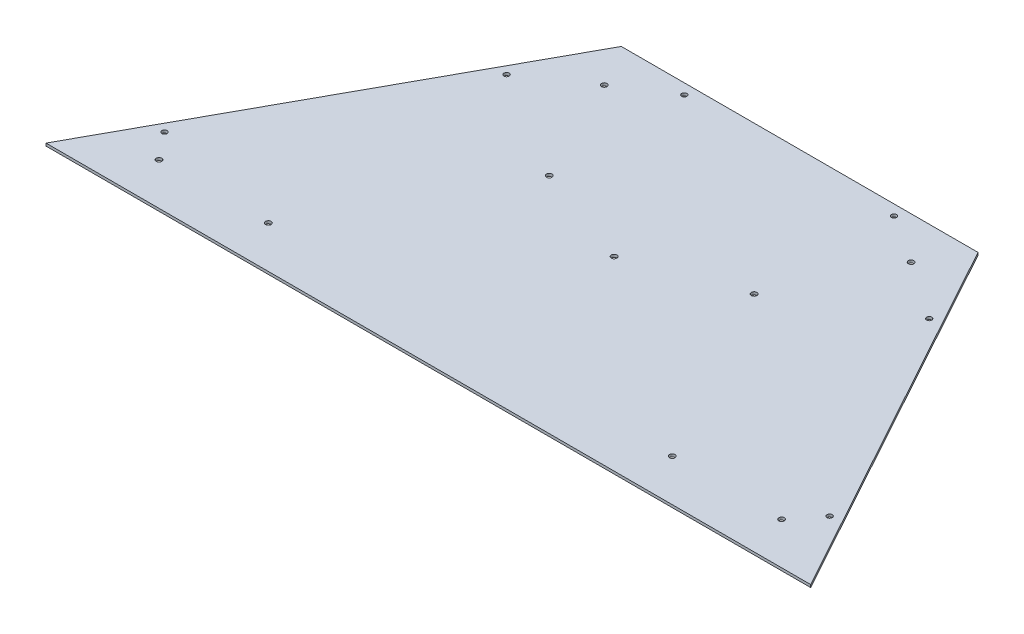
ISO-10303-21;
HEADER;
FILE_DESCRIPTION(('STEP AP214'),'2;1');
FILE_NAME('part.step','',(''),(''),'','','');
FILE_SCHEMA(('AUTOMOTIVE_DESIGN { 1 0 10303 214 1 1 1 1 }'));
ENDSEC;
DATA;
#1=APPLICATION_CONTEXT('core data for automotive mechanical design processes');
#2=APPLICATION_PROTOCOL_DEFINITION('international standard','automotive_design',2000,#1);
#3=PRODUCT_CONTEXT('',#1,'mechanical');
#4=PRODUCT('Part','Part','',(#3));
#5=PRODUCT_RELATED_PRODUCT_CATEGORY('part','',(#4));
#6=PRODUCT_DEFINITION_FORMATION('','',#4);
#7=PRODUCT_DEFINITION_CONTEXT('part definition',#1,'design');
#8=PRODUCT_DEFINITION('design','',#6,#7);
#9=PRODUCT_DEFINITION_SHAPE('','',#8);
#10=(LENGTH_UNIT() NAMED_UNIT(*) SI_UNIT(.MILLI.,.METRE.));
#11=(NAMED_UNIT(*) PLANE_ANGLE_UNIT() SI_UNIT($,.RADIAN.));
#12=(NAMED_UNIT(*) SI_UNIT($,.STERADIAN.) SOLID_ANGLE_UNIT());
#13=UNCERTAINTY_MEASURE_WITH_UNIT(LENGTH_MEASURE(1.E-05),#10,'distance_accuracy_value','');
#14=(GEOMETRIC_REPRESENTATION_CONTEXT(3) GLOBAL_UNCERTAINTY_ASSIGNED_CONTEXT((#13)) GLOBAL_UNIT_ASSIGNED_CONTEXT((#10,
#11,#12)) REPRESENTATION_CONTEXT('',''));
#15=CARTESIAN_POINT('',(0.,0.,0.));
#16=DIRECTION('',(0.,0.,1.));
#17=DIRECTION('',(1.,0.,0.));
#18=AXIS2_PLACEMENT_3D('',#15,#16,#17);
#19=CARTESIAN_POINT('',(0.,0.,0.));
#20=DIRECTION('',(0.,-1.,0.));
#21=DIRECTION('',(0.,0.,-1.));
#22=AXIS2_PLACEMENT_3D('',#19,#20,#21);
#23=PLANE('',#22);
#24=CARTESIAN_POINT('',(-376.682,0.,-50.7999999999999));
#25=DIRECTION('',(0.,1.,0.));
#26=DIRECTION('',(0.,0.,1.));
#27=AXIS2_PLACEMENT_3D('',#24,#25,#26);
#28=CIRCLE('',#27,3.37819999999989);
#29=CARTESIAN_POINT('',(-376.682,0.,-47.4218));
#30=VERTEX_POINT('',#29);
#31=EDGE_CURVE('E197',#30,#30,#28,.T.);
#32=ORIENTED_EDGE('',*,*,#31,.T.);
#33=EDGE_LOOP('',(#32));
#34=FACE_BOUND('',#33,.T.);
#35=CARTESIAN_POINT('',(-244.348,0.,-50.7999999999999));
#36=DIRECTION('',(0.,1.,0.));
#37=DIRECTION('',(0.,0.,1.));
#38=AXIS2_PLACEMENT_3D('',#35,#36,#37);
#39=CIRCLE('',#38,3.37819999999989);
#40=CARTESIAN_POINT('',(-244.348,0.,-47.4218));
#41=VERTEX_POINT('',#40);
#42=EDGE_CURVE('E191',#41,#41,#39,.T.);
#43=ORIENTED_EDGE('',*,*,#42,.T.);
#44=EDGE_LOOP('',(#43));
#45=FACE_BOUND('',#44,.T.);
#46=CARTESIAN_POINT('',(-126.873,0.,-436.565026529998));
#47=DIRECTION('',(0.,1.,0.));
#48=DIRECTION('',(0.,0.,1.));
#49=AXIS2_PLACEMENT_3D('',#46,#47,#48);
#50=CIRCLE('',#49,3.17499999999989);
#51=CARTESIAN_POINT('',(-126.873,0.,-433.390026529998));
#52=VERTEX_POINT('',#51);
#53=EDGE_CURVE('E131',#52,#52,#50,.T.);
#54=ORIENTED_EDGE('',*,*,#53,.T.);
#55=EDGE_LOOP('',(#54));
#56=FACE_BOUND('',#55,.T.);
#57=CARTESIAN_POINT('',(402.368285269326,0.,-83.1601712777649));
#58=DIRECTION('',(0.,1.,0.));
#59=DIRECTION('',(0.,0.,1.));
#60=AXIS2_PLACEMENT_3D('',#57,#58,#59);
#61=CIRCLE('',#60,3.17499999999987);
#62=CARTESIAN_POINT('',(402.368285269326,0.,-79.9851712777651));
#63=VERTEX_POINT('',#62);
#64=EDGE_CURVE('E125',#63,#63,#61,.T.);
#65=ORIENTED_EDGE('',*,*,#64,.T.);
#66=EDGE_LOOP('',(#65));
#67=FACE_BOUND('',#66,.T.);
#68=CARTESIAN_POINT('',(255.632309055253,0.,-350.31479557707));
#69=DIRECTION('',(0.,1.,0.));
#70=DIRECTION('',(0.,0.,1.));
#71=AXIS2_PLACEMENT_3D('',#68,#69,#70);
#72=CIRCLE('',#71,3.17499999999987);
#73=CARTESIAN_POINT('',(255.632309055253,0.,-347.13979557707));
#74=VERTEX_POINT('',#73);
#75=EDGE_CURVE('E119',#74,#74,#72,.T.);
#76=ORIENTED_EDGE('',*,*,#75,.T.);
#77=EDGE_LOOP('',(#76));
#78=FACE_BOUND('',#77,.T.);
#79=CARTESIAN_POINT('',(126.873,0.,-436.565026529998));
#80=DIRECTION('',(0.,1.,0.));
#81=DIRECTION('',(0.,0.,1.));
#82=AXIS2_PLACEMENT_3D('',#79,#80,#81);
#83=CIRCLE('',#82,3.1749999999999);
#84=CARTESIAN_POINT('',(126.873,0.,-433.390026529998));
#85=VERTEX_POINT('',#84);
#86=EDGE_CURVE('E103',#85,#85,#83,.T.);
#87=ORIENTED_EDGE('',*,*,#86,.T.);
#88=EDGE_LOOP('',(#87));
#89=FACE_BOUND('',#88,.T.);
#90=DIRECTION('',(1.,0.,0.));
#91=VECTOR('',#90,1.);
#92=CARTESIAN_POINT('',(462.534,0.,-1.08537011059561E-13));
#93=LINE('',#92,#91);
#94=CARTESIAN_POINT('',(-462.534,0.,0.));
#95=VERTEX_POINT('',#94);
#96=CARTESIAN_POINT('',(462.534,0.,-1.08537011059561E-13));
#97=VERTEX_POINT('',#96);
#98=EDGE_CURVE('E100',#95,#97,#93,.T.);
#99=ORIENTED_EDGE('',*,*,#98,.F.);
#100=DIRECTION('',(-0.481417244796828,0.,0.876491549538403));
#101=VECTOR('',#100,1.);
#102=CARTESIAN_POINT('',(-462.534,0.,0.));
#103=LINE('',#102,#101);
#104=CARTESIAN_POINT('',(-215.773,0.,-449.265026529998));
#105=VERTEX_POINT('',#104);
#106=EDGE_CURVE('E75',#105,#95,#103,.T.);
#107=ORIENTED_EDGE('',*,*,#106,.F.);
#108=DIRECTION('',(-1.,0.,0.));
#109=VECTOR('',#108,1.);
#110=CARTESIAN_POINT('',(-215.773,0.,-449.265026529998));
#111=LINE('',#110,#109);
#112=CARTESIAN_POINT('',(215.773,0.,-449.265026529998));
#113=VERTEX_POINT('',#112);
#114=EDGE_CURVE('E69',#113,#105,#111,.T.);
#115=ORIENTED_EDGE('',*,*,#114,.F.);
#116=DIRECTION('',(-0.481417244796829,0.,-0.876491549538403));
#117=VECTOR('',#116,1.);
#118=CARTESIAN_POINT('',(215.773,0.,-449.265026529998));
#119=LINE('',#118,#117);
#120=EDGE_CURVE('E92',#97,#113,#119,.T.);
#121=ORIENTED_EDGE('',*,*,#120,.F.);
#122=EDGE_LOOP('',(#99,#107,#115,#121));
#123=FACE_BOUND('',#122,.T.);
#124=CARTESIAN_POINT('',(-255.632309055253,0.,-350.31479557707));
#125=DIRECTION('',(0.,1.,0.));
#126=DIRECTION('',(0.,0.,1.));
#127=AXIS2_PLACEMENT_3D('',#124,#125,#126);
#128=CIRCLE('',#127,3.17499999999987);
#129=CARTESIAN_POINT('',(-255.632309055253,0.,-347.13979557707));
#130=VERTEX_POINT('',#129);
#131=EDGE_CURVE('E137',#130,#130,#128,.T.);
#132=ORIENTED_EDGE('',*,*,#131,.T.);
#133=EDGE_LOOP('',(#132));
#134=FACE_BOUND('',#133,.T.);
#135=CARTESIAN_POINT('',(-402.368285269326,0.,-83.1601712777647));
#136=DIRECTION('',(0.,1.,0.));
#137=DIRECTION('',(0.,0.,1.));
#138=AXIS2_PLACEMENT_3D('',#135,#136,#137);
#139=CIRCLE('',#138,3.17499999999987);
#140=CARTESIAN_POINT('',(-402.368285269326,0.,-79.9851712777648));
#141=VERTEX_POINT('',#140);
#142=EDGE_CURVE('E143',#141,#141,#139,.T.);
#143=ORIENTED_EDGE('',*,*,#142,.T.);
#144=EDGE_LOOP('',(#143));
#145=FACE_BOUND('',#144,.T.);
#146=CARTESIAN_POINT('',(123.952,0.,-270.256));
#147=DIRECTION('',(0.,1.,0.));
#148=DIRECTION('',(0.,0.,1.));
#149=AXIS2_PLACEMENT_3D('',#146,#147,#148);
#150=CIRCLE('',#149,3.37819999999989);
#151=CARTESIAN_POINT('',(123.952,0.,-266.8778));
#152=VERTEX_POINT('',#151);
#153=EDGE_CURVE('E149',#152,#152,#150,.T.);
#154=ORIENTED_EDGE('',*,*,#153,.T.);
#155=EDGE_LOOP('',(#154));
#156=FACE_BOUND('',#155,.T.);
#157=CARTESIAN_POINT('',(185.674,0.,-398.526));
#158=DIRECTION('',(0.,1.,0.));
#159=DIRECTION('',(0.,0.,1.));
#160=AXIS2_PLACEMENT_3D('',#157,#158,#159);
#161=CIRCLE('',#160,3.37819999999989);
#162=CARTESIAN_POINT('',(185.674,0.,-395.1478));
#163=VERTEX_POINT('',#162);
#164=EDGE_CURVE('E155',#163,#163,#161,.T.);
#165=ORIENTED_EDGE('',*,*,#164,.T.);
#166=EDGE_LOOP('',(#165));
#167=FACE_BOUND('',#166,.T.);
#168=CARTESIAN_POINT('',(244.348,0.,-50.8000000000001));
#169=DIRECTION('',(0.,1.,0.));
#170=DIRECTION('',(0.,0.,1.));
#171=AXIS2_PLACEMENT_3D('',#168,#169,#170);
#172=CIRCLE('',#171,3.37819999999989);
#173=CARTESIAN_POINT('',(244.348,0.,-47.4218000000002));
#174=VERTEX_POINT('',#173);
#175=EDGE_CURVE('E161',#174,#174,#172,.T.);
#176=ORIENTED_EDGE('',*,*,#175,.T.);
#177=EDGE_LOOP('',(#176));
#178=FACE_BOUND('',#177,.T.);
#179=CARTESIAN_POINT('',(376.682,0.,-50.8000000000002));
#180=DIRECTION('',(0.,1.,0.));
#181=DIRECTION('',(0.,0.,1.));
#182=AXIS2_PLACEMENT_3D('',#179,#180,#181);
#183=CIRCLE('',#182,3.37819999999989);
#184=CARTESIAN_POINT('',(376.682,0.,-47.4218000000003));
#185=VERTEX_POINT('',#184);
#186=EDGE_CURVE('E167',#185,#185,#183,.T.);
#187=ORIENTED_EDGE('',*,*,#186,.T.);
#188=EDGE_LOOP('',(#187));
#189=FACE_BOUND('',#188,.T.);
#190=CARTESIAN_POINT('',(0.,0.,-224.79));
#191=DIRECTION('',(0.,1.,0.));
#192=DIRECTION('',(0.,0.,1.));
#193=AXIS2_PLACEMENT_3D('',#190,#191,#192);
#194=CIRCLE('',#193,3.37819999999989);
#195=CARTESIAN_POINT('',(0.,0.,-221.4118));
#196=VERTEX_POINT('',#195);
#197=EDGE_CURVE('E173',#196,#196,#194,.T.);
#198=ORIENTED_EDGE('',*,*,#197,.T.);
#199=EDGE_LOOP('',(#198));
#200=FACE_BOUND('',#199,.T.);
#201=CARTESIAN_POINT('',(-185.674,0.,-398.526));
#202=DIRECTION('',(0.,1.,0.));
#203=DIRECTION('',(0.,0.,1.));
#204=AXIS2_PLACEMENT_3D('',#201,#202,#203);
#205=CIRCLE('',#204,3.37819999999989);
#206=CARTESIAN_POINT('',(-185.674,0.,-395.1478));
#207=VERTEX_POINT('',#206);
#208=EDGE_CURVE('E179',#207,#207,#205,.T.);
#209=ORIENTED_EDGE('',*,*,#208,.T.);
#210=EDGE_LOOP('',(#209));
#211=FACE_BOUND('',#210,.T.);
#212=CARTESIAN_POINT('',(-123.952,0.,-270.256));
#213=DIRECTION('',(0.,1.,0.));
#214=DIRECTION('',(0.,0.,1.));
#215=AXIS2_PLACEMENT_3D('',#212,#213,#214);
#216=CIRCLE('',#215,3.37819999999989);
#217=CARTESIAN_POINT('',(-123.952,0.,-266.8778));
#218=VERTEX_POINT('',#217);
#219=EDGE_CURVE('E185',#218,#218,#216,.T.);
#220=ORIENTED_EDGE('',*,*,#219,.T.);
#221=EDGE_LOOP('',(#220));
#222=FACE_BOUND('',#221,.T.);
#223=ADVANCED_FACE('F35',(#34,#45,#56,#67,#78,#89,#123,#134,#145,#156,#167,#178,#189,#200,#211,
#222),#23,.T.);
#224=CARTESIAN_POINT('',(0.,3.175,0.));
#225=DIRECTION('',(0.,-1.,0.));
#226=DIRECTION('',(0.,0.,-1.));
#227=AXIS2_PLACEMENT_3D('',#224,#225,#226);
#228=PLANE('',#227);
#229=CARTESIAN_POINT('',(-376.682,3.175,-50.7999999999999));
#230=DIRECTION('',(0.,1.,0.));
#231=DIRECTION('',(0.,0.,1.));
#232=AXIS2_PLACEMENT_3D('',#229,#230,#231);
#233=CIRCLE('',#232,3.37819999999989);
#234=CARTESIAN_POINT('',(-376.682,3.175,-47.4218));
#235=VERTEX_POINT('',#234);
#236=EDGE_CURVE('E200',#235,#235,#233,.T.);
#237=ORIENTED_EDGE('',*,*,#236,.F.);
#238=EDGE_LOOP('',(#237));
#239=FACE_BOUND('',#238,.T.);
#240=CARTESIAN_POINT('',(-244.348,3.175,-50.7999999999999));
#241=DIRECTION('',(0.,1.,0.));
#242=DIRECTION('',(0.,0.,1.));
#243=AXIS2_PLACEMENT_3D('',#240,#241,#242);
#244=CIRCLE('',#243,3.37819999999989);
#245=CARTESIAN_POINT('',(-244.348,3.175,-47.4218));
#246=VERTEX_POINT('',#245);
#247=EDGE_CURVE('E194',#246,#246,#244,.T.);
#248=ORIENTED_EDGE('',*,*,#247,.F.);
#249=EDGE_LOOP('',(#248));
#250=FACE_BOUND('',#249,.T.);
#251=CARTESIAN_POINT('',(-123.952,3.175,-270.256));
#252=DIRECTION('',(0.,1.,0.));
#253=DIRECTION('',(0.,0.,1.));
#254=AXIS2_PLACEMENT_3D('',#251,#252,#253);
#255=CIRCLE('',#254,3.37819999999989);
#256=CARTESIAN_POINT('',(-123.952,3.175,-266.8778));
#257=VERTEX_POINT('',#256);
#258=EDGE_CURVE('E188',#257,#257,#255,.T.);
#259=ORIENTED_EDGE('',*,*,#258,.F.);
#260=EDGE_LOOP('',(#259));
#261=FACE_BOUND('',#260,.T.);
#262=CARTESIAN_POINT('',(-185.674,3.175,-398.526));
#263=DIRECTION('',(0.,1.,0.));
#264=DIRECTION('',(0.,0.,1.));
#265=AXIS2_PLACEMENT_3D('',#262,#263,#264);
#266=CIRCLE('',#265,3.37819999999989);
#267=CARTESIAN_POINT('',(-185.674,3.175,-395.1478));
#268=VERTEX_POINT('',#267);
#269=EDGE_CURVE('E182',#268,#268,#266,.T.);
#270=ORIENTED_EDGE('',*,*,#269,.F.);
#271=EDGE_LOOP('',(#270));
#272=FACE_BOUND('',#271,.T.);
#273=CARTESIAN_POINT('',(376.682,3.175,-50.8000000000002));
#274=DIRECTION('',(0.,1.,0.));
#275=DIRECTION('',(0.,0.,1.));
#276=AXIS2_PLACEMENT_3D('',#273,#274,#275);
#277=CIRCLE('',#276,3.37819999999989);
#278=CARTESIAN_POINT('',(376.682,3.175,-47.4218000000003));
#279=VERTEX_POINT('',#278);
#280=EDGE_CURVE('E170',#279,#279,#277,.T.);
#281=ORIENTED_EDGE('',*,*,#280,.F.);
#282=EDGE_LOOP('',(#281));
#283=FACE_BOUND('',#282,.T.);
#284=CARTESIAN_POINT('',(244.348,3.175,-50.8000000000001));
#285=DIRECTION('',(0.,1.,0.));
#286=DIRECTION('',(0.,0.,1.));
#287=AXIS2_PLACEMENT_3D('',#284,#285,#286);
#288=CIRCLE('',#287,3.37819999999989);
#289=CARTESIAN_POINT('',(244.348,3.175,-47.4218000000002));
#290=VERTEX_POINT('',#289);
#291=EDGE_CURVE('E164',#290,#290,#288,.T.);
#292=ORIENTED_EDGE('',*,*,#291,.F.);
#293=EDGE_LOOP('',(#292));
#294=FACE_BOUND('',#293,.T.);
#295=CARTESIAN_POINT('',(185.674,3.175,-398.526));
#296=DIRECTION('',(0.,1.,0.));
#297=DIRECTION('',(0.,0.,1.));
#298=AXIS2_PLACEMENT_3D('',#295,#296,#297);
#299=CIRCLE('',#298,3.37819999999989);
#300=CARTESIAN_POINT('',(185.674,3.175,-395.1478));
#301=VERTEX_POINT('',#300);
#302=EDGE_CURVE('E158',#301,#301,#299,.T.);
#303=ORIENTED_EDGE('',*,*,#302,.F.);
#304=EDGE_LOOP('',(#303));
#305=FACE_BOUND('',#304,.T.);
#306=CARTESIAN_POINT('',(123.952,3.175,-270.256));
#307=DIRECTION('',(0.,1.,0.));
#308=DIRECTION('',(0.,0.,1.));
#309=AXIS2_PLACEMENT_3D('',#306,#307,#308);
#310=CIRCLE('',#309,3.37819999999989);
#311=CARTESIAN_POINT('',(123.952,3.175,-266.8778));
#312=VERTEX_POINT('',#311);
#313=EDGE_CURVE('E152',#312,#312,#310,.T.);
#314=ORIENTED_EDGE('',*,*,#313,.F.);
#315=EDGE_LOOP('',(#314));
#316=FACE_BOUND('',#315,.T.);
#317=CARTESIAN_POINT('',(-402.368285269326,3.175,-83.1601712777647));
#318=DIRECTION('',(0.,1.,0.));
#319=DIRECTION('',(0.,0.,1.));
#320=AXIS2_PLACEMENT_3D('',#317,#318,#319);
#321=CIRCLE('',#320,3.17499999999987);
#322=CARTESIAN_POINT('',(-402.368285269326,3.175,-79.9851712777648));
#323=VERTEX_POINT('',#322);
#324=EDGE_CURVE('E146',#323,#323,#321,.T.);
#325=ORIENTED_EDGE('',*,*,#324,.F.);
#326=EDGE_LOOP('',(#325));
#327=FACE_BOUND('',#326,.T.);
#328=CARTESIAN_POINT('',(-255.632309055253,3.175,-350.31479557707));
#329=DIRECTION('',(0.,1.,0.));
#330=DIRECTION('',(0.,0.,1.));
#331=AXIS2_PLACEMENT_3D('',#328,#329,#330);
#332=CIRCLE('',#331,3.17499999999987);
#333=CARTESIAN_POINT('',(-255.632309055253,3.175,-347.13979557707));
#334=VERTEX_POINT('',#333);
#335=EDGE_CURVE('E140',#334,#334,#332,.T.);
#336=ORIENTED_EDGE('',*,*,#335,.F.);
#337=EDGE_LOOP('',(#336));
#338=FACE_BOUND('',#337,.T.);
#339=CARTESIAN_POINT('',(-126.873,3.175,-436.565026529998));
#340=DIRECTION('',(0.,1.,0.));
#341=DIRECTION('',(0.,0.,1.));
#342=AXIS2_PLACEMENT_3D('',#339,#340,#341);
#343=CIRCLE('',#342,3.17499999999989);
#344=CARTESIAN_POINT('',(-126.873,3.175,-433.390026529998));
#345=VERTEX_POINT('',#344);
#346=EDGE_CURVE('E134',#345,#345,#343,.T.);
#347=ORIENTED_EDGE('',*,*,#346,.F.);
#348=EDGE_LOOP('',(#347));
#349=FACE_BOUND('',#348,.T.);
#350=CARTESIAN_POINT('',(402.368285269326,3.175,-83.1601712777649));
#351=DIRECTION('',(0.,1.,0.));
#352=DIRECTION('',(0.,0.,1.));
#353=AXIS2_PLACEMENT_3D('',#350,#351,#352);
#354=CIRCLE('',#353,3.17499999999987);
#355=CARTESIAN_POINT('',(402.368285269326,3.175,-79.9851712777651));
#356=VERTEX_POINT('',#355);
#357=EDGE_CURVE('E128',#356,#356,#354,.T.);
#358=ORIENTED_EDGE('',*,*,#357,.F.);
#359=EDGE_LOOP('',(#358));
#360=FACE_BOUND('',#359,.T.);
#361=CARTESIAN_POINT('',(255.632309055253,3.175,-350.31479557707));
#362=DIRECTION('',(0.,1.,0.));
#363=DIRECTION('',(0.,0.,1.));
#364=AXIS2_PLACEMENT_3D('',#361,#362,#363);
#365=CIRCLE('',#364,3.17499999999987);
#366=CARTESIAN_POINT('',(255.632309055253,3.175,-347.13979557707));
#367=VERTEX_POINT('',#366);
#368=EDGE_CURVE('E122',#367,#367,#365,.T.);
#369=ORIENTED_EDGE('',*,*,#368,.F.);
#370=EDGE_LOOP('',(#369));
#371=FACE_BOUND('',#370,.T.);
#372=CARTESIAN_POINT('',(126.873,3.175,-436.565026529998));
#373=DIRECTION('',(0.,1.,0.));
#374=DIRECTION('',(0.,0.,1.));
#375=AXIS2_PLACEMENT_3D('',#372,#373,#374);
#376=CIRCLE('',#375,3.1749999999999);
#377=CARTESIAN_POINT('',(126.873,3.175,-433.390026529998));
#378=VERTEX_POINT('',#377);
#379=EDGE_CURVE('E116',#378,#378,#376,.T.);
#380=ORIENTED_EDGE('',*,*,#379,.F.);
#381=EDGE_LOOP('',(#380));
#382=FACE_BOUND('',#381,.T.);
#383=DIRECTION('',(1.,0.,0.));
#384=VECTOR('',#383,1.);
#385=CARTESIAN_POINT('',(462.534,3.175,-1.08537011059561E-13));
#386=LINE('',#385,#384);
#387=CARTESIAN_POINT('',(-462.534,3.175,0.));
#388=VERTEX_POINT('',#387);
#389=CARTESIAN_POINT('',(462.534,3.175,-1.08537011059561E-13));
#390=VERTEX_POINT('',#389);
#391=EDGE_CURVE('E88',#388,#390,#386,.T.);
#392=ORIENTED_EDGE('',*,*,#391,.T.);
#393=DIRECTION('',(-0.481417244796829,0.,-0.876491549538403));
#394=VECTOR('',#393,1.);
#395=CARTESIAN_POINT('',(215.773,3.175,-449.265026529998));
#396=LINE('',#395,#394);
#397=CARTESIAN_POINT('',(215.773,3.175,-449.265026529998));
#398=VERTEX_POINT('',#397);
#399=EDGE_CURVE('E82',#390,#398,#396,.T.);
#400=ORIENTED_EDGE('',*,*,#399,.T.);
#401=DIRECTION('',(-1.,0.,0.));
#402=VECTOR('',#401,1.);
#403=CARTESIAN_POINT('',(-215.773,3.175,-449.265026529998));
#404=LINE('',#403,#402);
#405=CARTESIAN_POINT('',(-215.773,3.175,-449.265026529998));
#406=VERTEX_POINT('',#405);
#407=EDGE_CURVE('E86',#398,#406,#404,.T.);
#408=ORIENTED_EDGE('',*,*,#407,.T.);
#409=DIRECTION('',(-0.481417244796828,0.,0.876491549538403));
#410=VECTOR('',#409,1.);
#411=CARTESIAN_POINT('',(-462.534,3.175,0.));
#412=LINE('',#411,#410);
#413=EDGE_CURVE('E52',#406,#388,#412,.T.);
#414=ORIENTED_EDGE('',*,*,#413,.T.);
#415=EDGE_LOOP('',(#392,#400,#408,#414));
#416=FACE_BOUND('',#415,.T.);
#417=CARTESIAN_POINT('',(0.,3.175,-224.79));
#418=DIRECTION('',(0.,1.,0.));
#419=DIRECTION('',(0.,0.,1.));
#420=AXIS2_PLACEMENT_3D('',#417,#418,#419);
#421=CIRCLE('',#420,3.37819999999989);
#422=CARTESIAN_POINT('',(0.,3.175,-221.4118));
#423=VERTEX_POINT('',#422);
#424=EDGE_CURVE('E176',#423,#423,#421,.T.);
#425=ORIENTED_EDGE('',*,*,#424,.F.);
#426=EDGE_LOOP('',(#425));
#427=FACE_BOUND('',#426,.T.);
#428=ADVANCED_FACE('F83',(#239,#250,#261,#272,#283,#294,#305,#316,#327,#338,#349,#360,#371,#382,
#416,#427),#228,.F.);
#429=CARTESIAN_POINT('',(462.534,3.175,-1.08537011059561E-13));
#430=DIRECTION('',(0.,0.,-1.));
#431=DIRECTION('',(-1.,0.,0.));
#432=AXIS2_PLACEMENT_3D('',#429,#430,#431);
#433=PLANE('',#432);
#434=ORIENTED_EDGE('',*,*,#98,.T.);
#435=DIRECTION('',(0.,-1.,0.));
#436=VECTOR('',#435,1.);
#437=CARTESIAN_POINT('',(462.534,3.175,-1.08537011059561E-13));
#438=LINE('',#437,#436);
#439=EDGE_CURVE('E11',#390,#97,#438,.T.);
#440=ORIENTED_EDGE('',*,*,#439,.F.);
#441=ORIENTED_EDGE('',*,*,#391,.F.);
#442=DIRECTION('',(0.,-1.,0.));
#443=VECTOR('',#442,1.);
#444=CARTESIAN_POINT('',(-462.534,3.175,0.));
#445=LINE('',#444,#443);
#446=EDGE_CURVE('E96',#388,#95,#445,.T.);
#447=ORIENTED_EDGE('',*,*,#446,.T.);
#448=EDGE_LOOP('',(#434,#440,#441,#447));
#449=FACE_BOUND('',#448,.T.);
#450=ADVANCED_FACE('F37',(#449),#433,.F.);
#451=CARTESIAN_POINT('',(215.773,3.175,-449.265026529998));
#452=DIRECTION('',(-0.876491549538403,0.,0.481417244796829));
#453=DIRECTION('',(0.481417244796829,0.,0.876491549538403));
#454=AXIS2_PLACEMENT_3D('',#451,#452,#453);
#455=PLANE('',#454);
#456=ORIENTED_EDGE('',*,*,#120,.T.);
#457=DIRECTION('',(0.,-1.,0.));
#458=VECTOR('',#457,1.);
#459=CARTESIAN_POINT('',(215.773,3.175,-449.265026529998));
#460=LINE('',#459,#458);
#461=EDGE_CURVE('E44',#398,#113,#460,.T.);
#462=ORIENTED_EDGE('',*,*,#461,.F.);
#463=ORIENTED_EDGE('',*,*,#399,.F.);
#464=ORIENTED_EDGE('',*,*,#439,.T.);
#465=EDGE_LOOP('',(#456,#462,#463,#464));
#466=FACE_BOUND('',#465,.T.);
#467=ADVANCED_FACE('F91',(#466),#455,.F.);
#468=CARTESIAN_POINT('',(-215.773,3.175,-449.265026529998));
#469=DIRECTION('',(0.,0.,1.));
#470=DIRECTION('',(1.,0.,0.));
#471=AXIS2_PLACEMENT_3D('',#468,#469,#470);
#472=PLANE('',#471);
#473=ORIENTED_EDGE('',*,*,#114,.T.);
#474=DIRECTION('',(0.,-1.,0.));
#475=VECTOR('',#474,1.);
#476=CARTESIAN_POINT('',(-215.773,3.175,-449.265026529998));
#477=LINE('',#476,#475);
#478=EDGE_CURVE('E93',#406,#105,#477,.T.);
#479=ORIENTED_EDGE('',*,*,#478,.F.);
#480=ORIENTED_EDGE('',*,*,#407,.F.);
#481=ORIENTED_EDGE('',*,*,#461,.T.);
#482=EDGE_LOOP('',(#473,#479,#480,#481));
#483=FACE_BOUND('',#482,.T.);
#484=ADVANCED_FACE('F94',(#483),#472,.F.);
#485=CARTESIAN_POINT('',(-462.534,3.175,0.));
#486=DIRECTION('',(0.876491549538403,0.,0.481417244796828));
#487=DIRECTION('',(0.481417244796828,0.,-0.876491549538403));
#488=AXIS2_PLACEMENT_3D('',#485,#486,#487);
#489=PLANE('',#488);
#490=ORIENTED_EDGE('',*,*,#106,.T.);
#491=ORIENTED_EDGE('',*,*,#446,.F.);
#492=ORIENTED_EDGE('',*,*,#413,.F.);
#493=ORIENTED_EDGE('',*,*,#478,.T.);
#494=EDGE_LOOP('',(#490,#491,#492,#493));
#495=FACE_BOUND('',#494,.T.);
#496=ADVANCED_FACE('F108',(#495),#489,.F.);
#497=CARTESIAN_POINT('',(126.873,3.175,-436.565026529998));
#498=DIRECTION('',(0.,1.,0.));
#499=DIRECTION('',(0.,0.,1.));
#500=AXIS2_PLACEMENT_3D('',#497,#498,#499);
#501=CYLINDRICAL_SURFACE('',#500,3.1749999999999);
#502=ORIENTED_EDGE('',*,*,#86,.F.);
#503=EDGE_LOOP('',(#502));
#504=FACE_BOUND('',#503,.T.);
#505=ORIENTED_EDGE('',*,*,#379,.T.);
#506=EDGE_LOOP('',(#505));
#507=FACE_BOUND('',#506,.T.);
#508=ADVANCED_FACE('F235',(#504,#507),#501,.F.);
#509=CARTESIAN_POINT('',(255.632309055253,3.175,-350.31479557707));
#510=DIRECTION('',(0.,1.,0.));
#511=DIRECTION('',(0.,0.,1.));
#512=AXIS2_PLACEMENT_3D('',#509,#510,#511);
#513=CYLINDRICAL_SURFACE('',#512,3.17499999999987);
#514=ORIENTED_EDGE('',*,*,#75,.F.);
#515=EDGE_LOOP('',(#514));
#516=FACE_BOUND('',#515,.T.);
#517=ORIENTED_EDGE('',*,*,#368,.T.);
#518=EDGE_LOOP('',(#517));
#519=FACE_BOUND('',#518,.T.);
#520=ADVANCED_FACE('F237',(#516,#519),#513,.F.);
#521=CARTESIAN_POINT('',(402.368285269326,3.175,-83.1601712777649));
#522=DIRECTION('',(0.,1.,0.));
#523=DIRECTION('',(0.,0.,1.));
#524=AXIS2_PLACEMENT_3D('',#521,#522,#523);
#525=CYLINDRICAL_SURFACE('',#524,3.17499999999987);
#526=ORIENTED_EDGE('',*,*,#64,.F.);
#527=EDGE_LOOP('',(#526));
#528=FACE_BOUND('',#527,.T.);
#529=ORIENTED_EDGE('',*,*,#357,.T.);
#530=EDGE_LOOP('',(#529));
#531=FACE_BOUND('',#530,.T.);
#532=ADVANCED_FACE('F244',(#528,#531),#525,.F.);
#533=CARTESIAN_POINT('',(-126.873,3.175,-436.565026529998));
#534=DIRECTION('',(0.,1.,0.));
#535=DIRECTION('',(0.,0.,1.));
#536=AXIS2_PLACEMENT_3D('',#533,#534,#535);
#537=CYLINDRICAL_SURFACE('',#536,3.17499999999989);
#538=ORIENTED_EDGE('',*,*,#53,.F.);
#539=EDGE_LOOP('',(#538));
#540=FACE_BOUND('',#539,.T.);
#541=ORIENTED_EDGE('',*,*,#346,.T.);
#542=EDGE_LOOP('',(#541));
#543=FACE_BOUND('',#542,.T.);
#544=ADVANCED_FACE('F373',(#540,#543),#537,.F.);
#545=CARTESIAN_POINT('',(-255.632309055253,3.175,-350.31479557707));
#546=DIRECTION('',(0.,1.,0.));
#547=DIRECTION('',(0.,0.,1.));
#548=AXIS2_PLACEMENT_3D('',#545,#546,#547);
#549=CYLINDRICAL_SURFACE('',#548,3.17499999999987);
#550=ORIENTED_EDGE('',*,*,#131,.F.);
#551=EDGE_LOOP('',(#550));
#552=FACE_BOUND('',#551,.T.);
#553=ORIENTED_EDGE('',*,*,#335,.T.);
#554=EDGE_LOOP('',(#553));
#555=FACE_BOUND('',#554,.T.);
#556=ADVANCED_FACE('F369',(#552,#555),#549,.F.);
#557=CARTESIAN_POINT('',(-402.368285269326,3.175,-83.1601712777647));
#558=DIRECTION('',(0.,1.,0.));
#559=DIRECTION('',(0.,0.,1.));
#560=AXIS2_PLACEMENT_3D('',#557,#558,#559);
#561=CYLINDRICAL_SURFACE('',#560,3.17499999999987);
#562=ORIENTED_EDGE('',*,*,#142,.F.);
#563=EDGE_LOOP('',(#562));
#564=FACE_BOUND('',#563,.T.);
#565=ORIENTED_EDGE('',*,*,#324,.T.);
#566=EDGE_LOOP('',(#565));
#567=FACE_BOUND('',#566,.T.);
#568=ADVANCED_FACE('F282',(#564,#567),#561,.F.);
#569=CARTESIAN_POINT('',(123.952,3.175,-270.256));
#570=DIRECTION('',(0.,1.,0.));
#571=DIRECTION('',(0.,0.,1.));
#572=AXIS2_PLACEMENT_3D('',#569,#570,#571);
#573=CYLINDRICAL_SURFACE('',#572,3.37819999999989);
#574=ORIENTED_EDGE('',*,*,#153,.F.);
#575=EDGE_LOOP('',(#574));
#576=FACE_BOUND('',#575,.T.);
#577=ORIENTED_EDGE('',*,*,#313,.T.);
#578=EDGE_LOOP('',(#577));
#579=FACE_BOUND('',#578,.T.);
#580=ADVANCED_FACE('F276',(#576,#579),#573,.F.);
#581=CARTESIAN_POINT('',(185.674,3.175,-398.526));
#582=DIRECTION('',(0.,1.,0.));
#583=DIRECTION('',(0.,0.,1.));
#584=AXIS2_PLACEMENT_3D('',#581,#582,#583);
#585=CYLINDRICAL_SURFACE('',#584,3.37819999999989);
#586=ORIENTED_EDGE('',*,*,#164,.F.);
#587=EDGE_LOOP('',(#586));
#588=FACE_BOUND('',#587,.T.);
#589=ORIENTED_EDGE('',*,*,#302,.T.);
#590=EDGE_LOOP('',(#589));
#591=FACE_BOUND('',#590,.T.);
#592=ADVANCED_FACE('F281',(#588,#591),#585,.F.);
#593=CARTESIAN_POINT('',(244.348,3.175,-50.8000000000001));
#594=DIRECTION('',(0.,1.,0.));
#595=DIRECTION('',(0.,0.,1.));
#596=AXIS2_PLACEMENT_3D('',#593,#594,#595);
#597=CYLINDRICAL_SURFACE('',#596,3.37819999999989);
#598=ORIENTED_EDGE('',*,*,#175,.F.);
#599=EDGE_LOOP('',(#598));
#600=FACE_BOUND('',#599,.T.);
#601=ORIENTED_EDGE('',*,*,#291,.T.);
#602=EDGE_LOOP('',(#601));
#603=FACE_BOUND('',#602,.T.);
#604=ADVANCED_FACE('F293',(#600,#603),#597,.F.);
#605=CARTESIAN_POINT('',(376.682,3.175,-50.8000000000002));
#606=DIRECTION('',(0.,1.,0.));
#607=DIRECTION('',(0.,0.,1.));
#608=AXIS2_PLACEMENT_3D('',#605,#606,#607);
#609=CYLINDRICAL_SURFACE('',#608,3.37819999999989);
#610=ORIENTED_EDGE('',*,*,#186,.F.);
#611=EDGE_LOOP('',(#610));
#612=FACE_BOUND('',#611,.T.);
#613=ORIENTED_EDGE('',*,*,#280,.T.);
#614=EDGE_LOOP('',(#613));
#615=FACE_BOUND('',#614,.T.);
#616=ADVANCED_FACE('F303',(#612,#615),#609,.F.);
#617=CARTESIAN_POINT('',(0.,3.175,-224.79));
#618=DIRECTION('',(0.,1.,0.));
#619=DIRECTION('',(0.,0.,1.));
#620=AXIS2_PLACEMENT_3D('',#617,#618,#619);
#621=CYLINDRICAL_SURFACE('',#620,3.37819999999989);
#622=ORIENTED_EDGE('',*,*,#197,.F.);
#623=EDGE_LOOP('',(#622));
#624=FACE_BOUND('',#623,.T.);
#625=ORIENTED_EDGE('',*,*,#424,.T.);
#626=EDGE_LOOP('',(#625));
#627=FACE_BOUND('',#626,.T.);
#628=ADVANCED_FACE('F313',(#624,#627),#621,.F.);
#629=CARTESIAN_POINT('',(-185.674,3.175,-398.526));
#630=DIRECTION('',(0.,1.,0.));
#631=DIRECTION('',(0.,0.,1.));
#632=AXIS2_PLACEMENT_3D('',#629,#630,#631);
#633=CYLINDRICAL_SURFACE('',#632,3.37819999999989);
#634=ORIENTED_EDGE('',*,*,#208,.F.);
#635=EDGE_LOOP('',(#634));
#636=FACE_BOUND('',#635,.T.);
#637=ORIENTED_EDGE('',*,*,#269,.T.);
#638=EDGE_LOOP('',(#637));
#639=FACE_BOUND('',#638,.T.);
#640=ADVANCED_FACE('F323',(#636,#639),#633,.F.);
#641=CARTESIAN_POINT('',(-123.952,3.175,-270.256));
#642=DIRECTION('',(0.,1.,0.));
#643=DIRECTION('',(0.,0.,1.));
#644=AXIS2_PLACEMENT_3D('',#641,#642,#643);
#645=CYLINDRICAL_SURFACE('',#644,3.37819999999989);
#646=ORIENTED_EDGE('',*,*,#219,.F.);
#647=EDGE_LOOP('',(#646));
#648=FACE_BOUND('',#647,.T.);
#649=ORIENTED_EDGE('',*,*,#258,.T.);
#650=EDGE_LOOP('',(#649));
#651=FACE_BOUND('',#650,.T.);
#652=ADVANCED_FACE('F333',(#648,#651),#645,.F.);
#653=CARTESIAN_POINT('',(-244.348,3.175,-50.7999999999999));
#654=DIRECTION('',(0.,1.,0.));
#655=DIRECTION('',(0.,0.,1.));
#656=AXIS2_PLACEMENT_3D('',#653,#654,#655);
#657=CYLINDRICAL_SURFACE('',#656,3.37819999999989);
#658=ORIENTED_EDGE('',*,*,#42,.F.);
#659=EDGE_LOOP('',(#658));
#660=FACE_BOUND('',#659,.T.);
#661=ORIENTED_EDGE('',*,*,#247,.T.);
#662=EDGE_LOOP('',(#661));
#663=FACE_BOUND('',#662,.T.);
#664=ADVANCED_FACE('F343',(#660,#663),#657,.F.);
#665=CARTESIAN_POINT('',(-376.682,3.175,-50.7999999999999));
#666=DIRECTION('',(0.,1.,0.));
#667=DIRECTION('',(0.,0.,1.));
#668=AXIS2_PLACEMENT_3D('',#665,#666,#667);
#669=CYLINDRICAL_SURFACE('',#668,3.37819999999989);
#670=ORIENTED_EDGE('',*,*,#31,.F.);
#671=EDGE_LOOP('',(#670));
#672=FACE_BOUND('',#671,.T.);
#673=ORIENTED_EDGE('',*,*,#236,.T.);
#674=EDGE_LOOP('',(#673));
#675=FACE_BOUND('',#674,.T.);
#676=ADVANCED_FACE('F204',(#672,#675),#669,.F.);
#677=CLOSED_SHELL('',(#223,#428,#450,#467,#484,#496,#508,#520,#532,#544,#556,#568,#580,#592,
#604,#616,#628,#640,#652,#664,#676));
#678=MANIFOLD_SOLID_BREP('B2',#677);
#679=ADVANCED_BREP_SHAPE_REPRESENTATION('',(#18,#678),#14);
#680=SHAPE_DEFINITION_REPRESENTATION(#9,#679);
ENDSEC;
END-ISO-10303-21;
